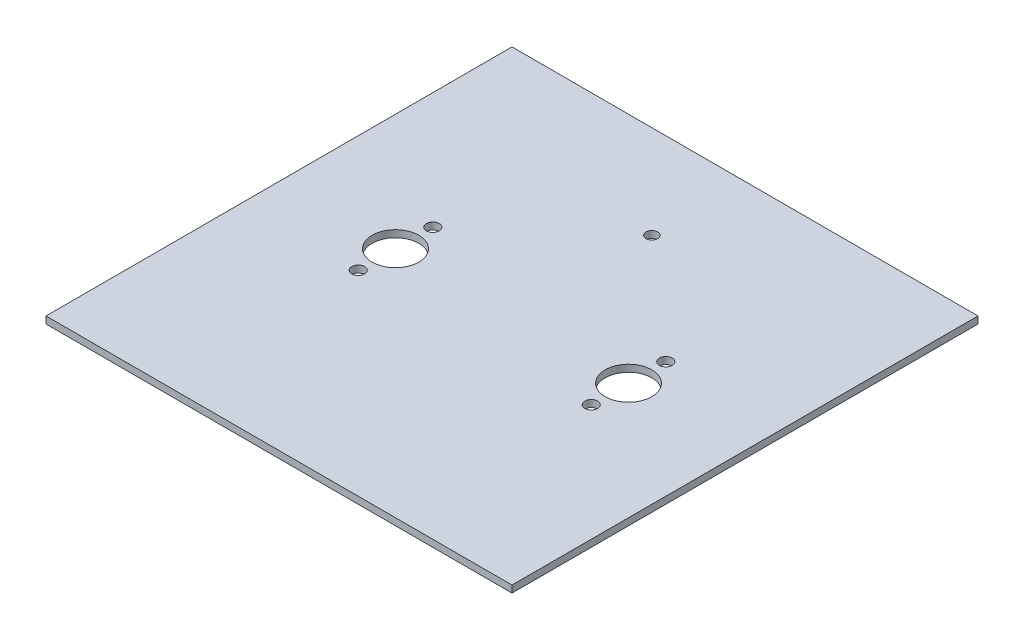
ISO-10303-21;
HEADER;
FILE_DESCRIPTION(('STEP AP214'),'2;1');
FILE_NAME('part.step','',(''),(''),'','','');
FILE_SCHEMA(('AUTOMOTIVE_DESIGN { 1 0 10303 214 1 1 1 1 }'));
ENDSEC;
DATA;
#1=APPLICATION_CONTEXT('core data for automotive mechanical design processes');
#2=APPLICATION_PROTOCOL_DEFINITION('international standard','automotive_design',2000,#1);
#3=PRODUCT_CONTEXT('',#1,'mechanical');
#4=PRODUCT('Part','Part','',(#3));
#5=PRODUCT_RELATED_PRODUCT_CATEGORY('part','',(#4));
#6=PRODUCT_DEFINITION_FORMATION('','',#4);
#7=PRODUCT_DEFINITION_CONTEXT('part definition',#1,'design');
#8=PRODUCT_DEFINITION('design','',#6,#7);
#9=PRODUCT_DEFINITION_SHAPE('','',#8);
#10=(LENGTH_UNIT() NAMED_UNIT(*) SI_UNIT(.MILLI.,.METRE.));
#11=(NAMED_UNIT(*) PLANE_ANGLE_UNIT() SI_UNIT($,.RADIAN.));
#12=(NAMED_UNIT(*) SI_UNIT($,.STERADIAN.) SOLID_ANGLE_UNIT());
#13=UNCERTAINTY_MEASURE_WITH_UNIT(LENGTH_MEASURE(1.E-05),#10,'distance_accuracy_value','');
#14=(GEOMETRIC_REPRESENTATION_CONTEXT(3) GLOBAL_UNCERTAINTY_ASSIGNED_CONTEXT((#13)) GLOBAL_UNIT_ASSIGNED_CONTEXT((#10,
#11,#12)) REPRESENTATION_CONTEXT('',''));
#15=CARTESIAN_POINT('',(0.,0.,0.));
#16=DIRECTION('',(0.,0.,1.));
#17=DIRECTION('',(1.,0.,0.));
#18=AXIS2_PLACEMENT_3D('',#15,#16,#17);
#19=CARTESIAN_POINT('',(0.,3.,0.));
#20=DIRECTION('',(0.,1.,0.));
#21=DIRECTION('',(0.,0.,1.));
#22=AXIS2_PLACEMENT_3D('',#19,#20,#21);
#23=PLANE('',#22);
#24=CARTESIAN_POINT('',(-50.,3.,-16.));
#25=DIRECTION('',(0.,1.,0.));
#26=DIRECTION('',(0.,0.,-1.));
#27=AXIS2_PLACEMENT_3D('',#24,#25,#26);
#28=CIRCLE('',#27,2.75000000000001);
#29=CARTESIAN_POINT('',(-50.,3.,-18.75));
#30=VERTEX_POINT('',#29);
#31=EDGE_CURVE('E141',#30,#30,#28,.T.);
#32=ORIENTED_EDGE('',*,*,#31,.F.);
#33=EDGE_LOOP('',(#32));
#34=FACE_BOUND('',#33,.T.);
#35=CARTESIAN_POINT('',(50.,3.,16.));
#36=DIRECTION('',(0.,1.,0.));
#37=DIRECTION('',(0.,0.,1.));
#38=AXIS2_PLACEMENT_3D('',#35,#36,#37);
#39=CIRCLE('',#38,2.74999999999999);
#40=CARTESIAN_POINT('',(50.,3.,18.75));
#41=VERTEX_POINT('',#40);
#42=EDGE_CURVE('E129',#41,#41,#39,.T.);
#43=ORIENTED_EDGE('',*,*,#42,.F.);
#44=EDGE_LOOP('',(#43));
#45=FACE_BOUND('',#44,.T.);
#46=CARTESIAN_POINT('',(50.,3.,0.));
#47=DIRECTION('',(0.,1.,0.));
#48=DIRECTION('',(0.,0.,1.));
#49=AXIS2_PLACEMENT_3D('',#46,#47,#48);
#50=CIRCLE('',#49,10.);
#51=CARTESIAN_POINT('',(50.,3.,10.));
#52=VERTEX_POINT('',#51);
#53=EDGE_CURVE('E117',#52,#52,#50,.T.);
#54=ORIENTED_EDGE('',*,*,#53,.F.);
#55=EDGE_LOOP('',(#54));
#56=FACE_BOUND('',#55,.T.);
#57=DIRECTION('',(0.,0.,1.));
#58=VECTOR('',#57,1.);
#59=CARTESIAN_POINT('',(-100.,3.,-100.));
#60=LINE('',#59,#58);
#61=CARTESIAN_POINT('',(-100.,3.,-100.));
#62=VERTEX_POINT('',#61);
#63=CARTESIAN_POINT('',(-100.,3.,100.));
#64=VERTEX_POINT('',#63);
#65=EDGE_CURVE('E87',#62,#64,#60,.T.);
#66=ORIENTED_EDGE('',*,*,#65,.T.);
#67=DIRECTION('',(1.,0.,0.));
#68=VECTOR('',#67,1.);
#69=CARTESIAN_POINT('',(-100.,3.,100.));
#70=LINE('',#69,#68);
#71=CARTESIAN_POINT('',(100.,3.,100.));
#72=VERTEX_POINT('',#71);
#73=EDGE_CURVE('E82',#64,#72,#70,.T.);
#74=ORIENTED_EDGE('',*,*,#73,.T.);
#75=DIRECTION('',(0.,0.,-1.));
#76=VECTOR('',#75,1.);
#77=CARTESIAN_POINT('',(100.,3.,-100.));
#78=LINE('',#77,#76);
#79=CARTESIAN_POINT('',(100.,3.,-100.));
#80=VERTEX_POINT('',#79);
#81=EDGE_CURVE('E85',#72,#80,#78,.T.);
#82=ORIENTED_EDGE('',*,*,#81,.T.);
#83=DIRECTION('',(-1.,0.,0.));
#84=VECTOR('',#83,1.);
#85=CARTESIAN_POINT('',(-100.,3.,-100.));
#86=LINE('',#85,#84);
#87=EDGE_CURVE('E52',#80,#62,#86,.T.);
#88=ORIENTED_EDGE('',*,*,#87,.T.);
#89=EDGE_LOOP('',(#66,#74,#82,#88));
#90=FACE_BOUND('',#89,.T.);
#91=CARTESIAN_POINT('',(0.,3.,-60.));
#92=DIRECTION('',(0.,1.,0.));
#93=DIRECTION('',(0.,0.,1.));
#94=AXIS2_PLACEMENT_3D('',#91,#92,#93);
#95=CIRCLE('',#94,2.5);
#96=CARTESIAN_POINT('',(0.,3.,-57.5));
#97=VERTEX_POINT('',#96);
#98=EDGE_CURVE('E102',#97,#97,#95,.T.);
#99=ORIENTED_EDGE('',*,*,#98,.F.);
#100=EDGE_LOOP('',(#99));
#101=FACE_BOUND('',#100,.T.);
#102=CARTESIAN_POINT('',(50.,3.,-16.));
#103=DIRECTION('',(0.,1.,0.));
#104=DIRECTION('',(0.,0.,1.));
#105=AXIS2_PLACEMENT_3D('',#102,#103,#104);
#106=CIRCLE('',#105,2.75);
#107=CARTESIAN_POINT('',(50.,3.,-13.25));
#108=VERTEX_POINT('',#107);
#109=EDGE_CURVE('E123',#108,#108,#106,.T.);
#110=ORIENTED_EDGE('',*,*,#109,.F.);
#111=EDGE_LOOP('',(#110));
#112=FACE_BOUND('',#111,.T.);
#113=CARTESIAN_POINT('',(-50.,3.,16.));
#114=DIRECTION('',(0.,1.,0.));
#115=DIRECTION('',(0.,0.,-1.));
#116=AXIS2_PLACEMENT_3D('',#113,#114,#115);
#117=CIRCLE('',#116,2.75000000000001);
#118=CARTESIAN_POINT('',(-50.,3.,13.25));
#119=VERTEX_POINT('',#118);
#120=EDGE_CURVE('E135',#119,#119,#117,.T.);
#121=ORIENTED_EDGE('',*,*,#120,.F.);
#122=EDGE_LOOP('',(#121));
#123=FACE_BOUND('',#122,.T.);
#124=CARTESIAN_POINT('',(-50.,3.,0.));
#125=DIRECTION('',(0.,1.,0.));
#126=DIRECTION('',(0.,0.,-1.));
#127=AXIS2_PLACEMENT_3D('',#124,#125,#126);
#128=CIRCLE('',#127,10.);
#129=CARTESIAN_POINT('',(-50.,3.,-10.));
#130=VERTEX_POINT('',#129);
#131=EDGE_CURVE('E147',#130,#130,#128,.T.);
#132=ORIENTED_EDGE('',*,*,#131,.F.);
#133=EDGE_LOOP('',(#132));
#134=FACE_BOUND('',#133,.T.);
#135=ADVANCED_FACE('F35',(#34,#45,#56,#90,#101,#112,#123,#134),#23,.T.);
#136=CARTESIAN_POINT('',(0.,0.,0.));
#137=DIRECTION('',(0.,1.,0.));
#138=DIRECTION('',(0.,0.,1.));
#139=AXIS2_PLACEMENT_3D('',#136,#137,#138);
#140=PLANE('',#139);
#141=DIRECTION('',(0.,0.,1.));
#142=VECTOR('',#141,1.);
#143=CARTESIAN_POINT('',(-100.,0.,-100.));
#144=LINE('',#143,#142);
#145=CARTESIAN_POINT('',(-100.,0.,-100.));
#146=VERTEX_POINT('',#145);
#147=CARTESIAN_POINT('',(-100.,0.,100.));
#148=VERTEX_POINT('',#147);
#149=EDGE_CURVE('E99',#146,#148,#144,.T.);
#150=ORIENTED_EDGE('',*,*,#149,.F.);
#151=DIRECTION('',(-1.,0.,0.));
#152=VECTOR('',#151,1.);
#153=CARTESIAN_POINT('',(-100.,0.,-100.));
#154=LINE('',#153,#152);
#155=CARTESIAN_POINT('',(100.,0.,-100.));
#156=VERTEX_POINT('',#155);
#157=EDGE_CURVE('E75',#156,#146,#154,.T.);
#158=ORIENTED_EDGE('',*,*,#157,.F.);
#159=DIRECTION('',(0.,0.,-1.));
#160=VECTOR('',#159,1.);
#161=CARTESIAN_POINT('',(100.,0.,-100.));
#162=LINE('',#161,#160);
#163=CARTESIAN_POINT('',(100.,0.,100.));
#164=VERTEX_POINT('',#163);
#165=EDGE_CURVE('E69',#164,#156,#162,.T.);
#166=ORIENTED_EDGE('',*,*,#165,.F.);
#167=DIRECTION('',(1.,0.,0.));
#168=VECTOR('',#167,1.);
#169=CARTESIAN_POINT('',(-100.,0.,100.));
#170=LINE('',#169,#168);
#171=EDGE_CURVE('E91',#148,#164,#170,.T.);
#172=ORIENTED_EDGE('',*,*,#171,.F.);
#173=EDGE_LOOP('',(#150,#158,#166,#172));
#174=FACE_BOUND('',#173,.T.);
#175=CARTESIAN_POINT('',(0.,0.,-60.));
#176=DIRECTION('',(0.,1.,0.));
#177=DIRECTION('',(0.,0.,1.));
#178=AXIS2_PLACEMENT_3D('',#175,#176,#177);
#179=CIRCLE('',#178,2.5);
#180=CARTESIAN_POINT('',(0.,0.,-57.5));
#181=VERTEX_POINT('',#180);
#182=EDGE_CURVE('E114',#181,#181,#179,.T.);
#183=ORIENTED_EDGE('',*,*,#182,.T.);
#184=EDGE_LOOP('',(#183));
#185=FACE_BOUND('',#184,.T.);
#186=CARTESIAN_POINT('',(50.,0.,0.));
#187=DIRECTION('',(0.,1.,0.));
#188=DIRECTION('',(0.,0.,1.));
#189=AXIS2_PLACEMENT_3D('',#186,#187,#188);
#190=CIRCLE('',#189,10.);
#191=CARTESIAN_POINT('',(50.,0.,10.));
#192=VERTEX_POINT('',#191);
#193=EDGE_CURVE('E120',#192,#192,#190,.T.);
#194=ORIENTED_EDGE('',*,*,#193,.T.);
#195=EDGE_LOOP('',(#194));
#196=FACE_BOUND('',#195,.T.);
#197=CARTESIAN_POINT('',(50.,0.,-16.));
#198=DIRECTION('',(0.,1.,0.));
#199=DIRECTION('',(0.,0.,1.));
#200=AXIS2_PLACEMENT_3D('',#197,#198,#199);
#201=CIRCLE('',#200,2.75);
#202=CARTESIAN_POINT('',(50.,0.,-13.25));
#203=VERTEX_POINT('',#202);
#204=EDGE_CURVE('E126',#203,#203,#201,.T.);
#205=ORIENTED_EDGE('',*,*,#204,.T.);
#206=EDGE_LOOP('',(#205));
#207=FACE_BOUND('',#206,.T.);
#208=CARTESIAN_POINT('',(50.,0.,16.));
#209=DIRECTION('',(0.,1.,0.));
#210=DIRECTION('',(0.,0.,1.));
#211=AXIS2_PLACEMENT_3D('',#208,#209,#210);
#212=CIRCLE('',#211,2.74999999999999);
#213=CARTESIAN_POINT('',(50.,0.,18.75));
#214=VERTEX_POINT('',#213);
#215=EDGE_CURVE('E132',#214,#214,#212,.T.);
#216=ORIENTED_EDGE('',*,*,#215,.T.);
#217=EDGE_LOOP('',(#216));
#218=FACE_BOUND('',#217,.T.);
#219=CARTESIAN_POINT('',(-50.,0.,16.));
#220=DIRECTION('',(0.,1.,0.));
#221=DIRECTION('',(0.,0.,-1.));
#222=AXIS2_PLACEMENT_3D('',#219,#220,#221);
#223=CIRCLE('',#222,2.75000000000001);
#224=CARTESIAN_POINT('',(-50.,0.,13.25));
#225=VERTEX_POINT('',#224);
#226=EDGE_CURVE('E138',#225,#225,#223,.T.);
#227=ORIENTED_EDGE('',*,*,#226,.T.);
#228=EDGE_LOOP('',(#227));
#229=FACE_BOUND('',#228,.T.);
#230=CARTESIAN_POINT('',(-50.,0.,-16.));
#231=DIRECTION('',(0.,1.,0.));
#232=DIRECTION('',(0.,0.,-1.));
#233=AXIS2_PLACEMENT_3D('',#230,#231,#232);
#234=CIRCLE('',#233,2.75000000000001);
#235=CARTESIAN_POINT('',(-50.,0.,-18.75));
#236=VERTEX_POINT('',#235);
#237=EDGE_CURVE('E144',#236,#236,#234,.T.);
#238=ORIENTED_EDGE('',*,*,#237,.T.);
#239=EDGE_LOOP('',(#238));
#240=FACE_BOUND('',#239,.T.);
#241=CARTESIAN_POINT('',(-50.,0.,0.));
#242=DIRECTION('',(0.,1.,0.));
#243=DIRECTION('',(0.,0.,-1.));
#244=AXIS2_PLACEMENT_3D('',#241,#242,#243);
#245=CIRCLE('',#244,10.);
#246=CARTESIAN_POINT('',(-50.,0.,-10.));
#247=VERTEX_POINT('',#246);
#248=EDGE_CURVE('E150',#247,#247,#245,.T.);
#249=ORIENTED_EDGE('',*,*,#248,.T.);
#250=EDGE_LOOP('',(#249));
#251=FACE_BOUND('',#250,.T.);
#252=ADVANCED_FACE('F110',(#174,#185,#196,#207,#218,#229,#240,#251),#140,.F.);
#253=CARTESIAN_POINT('',(-100.,3.,-100.));
#254=DIRECTION('',(1.,0.,0.));
#255=DIRECTION('',(0.,0.,-1.));
#256=AXIS2_PLACEMENT_3D('',#253,#254,#255);
#257=PLANE('',#256);
#258=ORIENTED_EDGE('',*,*,#149,.T.);
#259=DIRECTION('',(0.,-1.,0.));
#260=VECTOR('',#259,1.);
#261=CARTESIAN_POINT('',(-100.,3.,100.));
#262=LINE('',#261,#260);
#263=EDGE_CURVE('E11',#64,#148,#262,.T.);
#264=ORIENTED_EDGE('',*,*,#263,.F.);
#265=ORIENTED_EDGE('',*,*,#65,.F.);
#266=DIRECTION('',(0.,-1.,0.));
#267=VECTOR('',#266,1.);
#268=CARTESIAN_POINT('',(-100.,3.,-100.));
#269=LINE('',#268,#267);
#270=EDGE_CURVE('E95',#62,#146,#269,.T.);
#271=ORIENTED_EDGE('',*,*,#270,.T.);
#272=EDGE_LOOP('',(#258,#264,#265,#271));
#273=FACE_BOUND('',#272,.T.);
#274=ADVANCED_FACE('F37',(#273),#257,.F.);
#275=CARTESIAN_POINT('',(-100.,3.,100.));
#276=DIRECTION('',(0.,0.,-1.));
#277=DIRECTION('',(-1.,0.,0.));
#278=AXIS2_PLACEMENT_3D('',#275,#276,#277);
#279=PLANE('',#278);
#280=ORIENTED_EDGE('',*,*,#171,.T.);
#281=DIRECTION('',(0.,-1.,0.));
#282=VECTOR('',#281,1.);
#283=CARTESIAN_POINT('',(100.,3.,100.));
#284=LINE('',#283,#282);
#285=EDGE_CURVE('E44',#72,#164,#284,.T.);
#286=ORIENTED_EDGE('',*,*,#285,.F.);
#287=ORIENTED_EDGE('',*,*,#73,.F.);
#288=ORIENTED_EDGE('',*,*,#263,.T.);
#289=EDGE_LOOP('',(#280,#286,#287,#288));
#290=FACE_BOUND('',#289,.T.);
#291=ADVANCED_FACE('F90',(#290),#279,.F.);
#292=CARTESIAN_POINT('',(100.,3.,-100.));
#293=DIRECTION('',(-1.,0.,0.));
#294=DIRECTION('',(0.,0.,1.));
#295=AXIS2_PLACEMENT_3D('',#292,#293,#294);
#296=PLANE('',#295);
#297=ORIENTED_EDGE('',*,*,#165,.T.);
#298=DIRECTION('',(0.,-1.,0.));
#299=VECTOR('',#298,1.);
#300=CARTESIAN_POINT('',(100.,3.,-100.));
#301=LINE('',#300,#299);
#302=EDGE_CURVE('E92',#80,#156,#301,.T.);
#303=ORIENTED_EDGE('',*,*,#302,.F.);
#304=ORIENTED_EDGE('',*,*,#81,.F.);
#305=ORIENTED_EDGE('',*,*,#285,.T.);
#306=EDGE_LOOP('',(#297,#303,#304,#305));
#307=FACE_BOUND('',#306,.T.);
#308=ADVANCED_FACE('F93',(#307),#296,.F.);
#309=CARTESIAN_POINT('',(-100.,3.,-100.));
#310=DIRECTION('',(0.,0.,1.));
#311=DIRECTION('',(1.,0.,0.));
#312=AXIS2_PLACEMENT_3D('',#309,#310,#311);
#313=PLANE('',#312);
#314=ORIENTED_EDGE('',*,*,#157,.T.);
#315=ORIENTED_EDGE('',*,*,#270,.F.);
#316=ORIENTED_EDGE('',*,*,#87,.F.);
#317=ORIENTED_EDGE('',*,*,#302,.T.);
#318=EDGE_LOOP('',(#314,#315,#316,#317));
#319=FACE_BOUND('',#318,.T.);
#320=ADVANCED_FACE('F107',(#319),#313,.F.);
#321=CARTESIAN_POINT('',(0.,3.,-60.));
#322=DIRECTION('',(0.,-1.,0.));
#323=DIRECTION('',(0.,0.,-1.));
#324=AXIS2_PLACEMENT_3D('',#321,#322,#323);
#325=CYLINDRICAL_SURFACE('',#324,2.5);
#326=ORIENTED_EDGE('',*,*,#98,.T.);
#327=EDGE_LOOP('',(#326));
#328=FACE_BOUND('',#327,.T.);
#329=ORIENTED_EDGE('',*,*,#182,.F.);
#330=EDGE_LOOP('',(#329));
#331=FACE_BOUND('',#330,.T.);
#332=ADVANCED_FACE('F169',(#328,#331),#325,.F.);
#333=CARTESIAN_POINT('',(50.,3.,0.));
#334=DIRECTION('',(0.,-1.,0.));
#335=DIRECTION('',(0.,0.,-1.));
#336=AXIS2_PLACEMENT_3D('',#333,#334,#335);
#337=CYLINDRICAL_SURFACE('',#336,10.);
#338=ORIENTED_EDGE('',*,*,#53,.T.);
#339=EDGE_LOOP('',(#338));
#340=FACE_BOUND('',#339,.T.);
#341=ORIENTED_EDGE('',*,*,#193,.F.);
#342=EDGE_LOOP('',(#341));
#343=FACE_BOUND('',#342,.T.);
#344=ADVANCED_FACE('F215',(#340,#343),#337,.F.);
#345=CARTESIAN_POINT('',(50.,3.,-16.));
#346=DIRECTION('',(0.,-1.,0.));
#347=DIRECTION('',(0.,0.,-1.));
#348=AXIS2_PLACEMENT_3D('',#345,#346,#347);
#349=CYLINDRICAL_SURFACE('',#348,2.75);
#350=ORIENTED_EDGE('',*,*,#109,.T.);
#351=EDGE_LOOP('',(#350));
#352=FACE_BOUND('',#351,.T.);
#353=ORIENTED_EDGE('',*,*,#204,.F.);
#354=EDGE_LOOP('',(#353));
#355=FACE_BOUND('',#354,.T.);
#356=ADVANCED_FACE('F223',(#352,#355),#349,.F.);
#357=CARTESIAN_POINT('',(50.,3.,16.));
#358=DIRECTION('',(0.,-1.,0.));
#359=DIRECTION('',(0.,0.,-1.));
#360=AXIS2_PLACEMENT_3D('',#357,#358,#359);
#361=CYLINDRICAL_SURFACE('',#360,2.74999999999999);
#362=ORIENTED_EDGE('',*,*,#42,.T.);
#363=EDGE_LOOP('',(#362));
#364=FACE_BOUND('',#363,.T.);
#365=ORIENTED_EDGE('',*,*,#215,.F.);
#366=EDGE_LOOP('',(#365));
#367=FACE_BOUND('',#366,.T.);
#368=ADVANCED_FACE('F231',(#364,#367),#361,.F.);
#369=CARTESIAN_POINT('',(-50.,3.,16.));
#370=DIRECTION('',(0.,-1.,0.));
#371=DIRECTION('',(0.,0.,-1.));
#372=AXIS2_PLACEMENT_3D('',#369,#370,#371);
#373=CYLINDRICAL_SURFACE('',#372,2.75000000000001);
#374=ORIENTED_EDGE('',*,*,#120,.T.);
#375=EDGE_LOOP('',(#374));
#376=FACE_BOUND('',#375,.T.);
#377=ORIENTED_EDGE('',*,*,#226,.F.);
#378=EDGE_LOOP('',(#377));
#379=FACE_BOUND('',#378,.T.);
#380=ADVANCED_FACE('F240',(#376,#379),#373,.F.);
#381=CARTESIAN_POINT('',(-50.,3.,-16.));
#382=DIRECTION('',(0.,-1.,0.));
#383=DIRECTION('',(0.,0.,-1.));
#384=AXIS2_PLACEMENT_3D('',#381,#382,#383);
#385=CYLINDRICAL_SURFACE('',#384,2.75000000000001);
#386=ORIENTED_EDGE('',*,*,#31,.T.);
#387=EDGE_LOOP('',(#386));
#388=FACE_BOUND('',#387,.T.);
#389=ORIENTED_EDGE('',*,*,#237,.F.);
#390=EDGE_LOOP('',(#389));
#391=FACE_BOUND('',#390,.T.);
#392=ADVANCED_FACE('F249',(#388,#391),#385,.F.);
#393=CARTESIAN_POINT('',(-50.,3.,0.));
#394=DIRECTION('',(0.,-1.,0.));
#395=DIRECTION('',(0.,0.,-1.));
#396=AXIS2_PLACEMENT_3D('',#393,#394,#395);
#397=CYLINDRICAL_SURFACE('',#396,10.);
#398=ORIENTED_EDGE('',*,*,#131,.T.);
#399=EDGE_LOOP('',(#398));
#400=FACE_BOUND('',#399,.T.);
#401=ORIENTED_EDGE('',*,*,#248,.F.);
#402=EDGE_LOOP('',(#401));
#403=FACE_BOUND('',#402,.T.);
#404=ADVANCED_FACE('F156',(#400,#403),#397,.F.);
#405=CLOSED_SHELL('',(#135,#252,#274,#291,#308,#320,#332,#344,#356,#368,#380,#392,#404));
#406=MANIFOLD_SOLID_BREP('B2',#405);
#407=ADVANCED_BREP_SHAPE_REPRESENTATION('',(#18,#406),#14);
#408=SHAPE_DEFINITION_REPRESENTATION(#9,#407);
ENDSEC;
END-ISO-10303-21;
